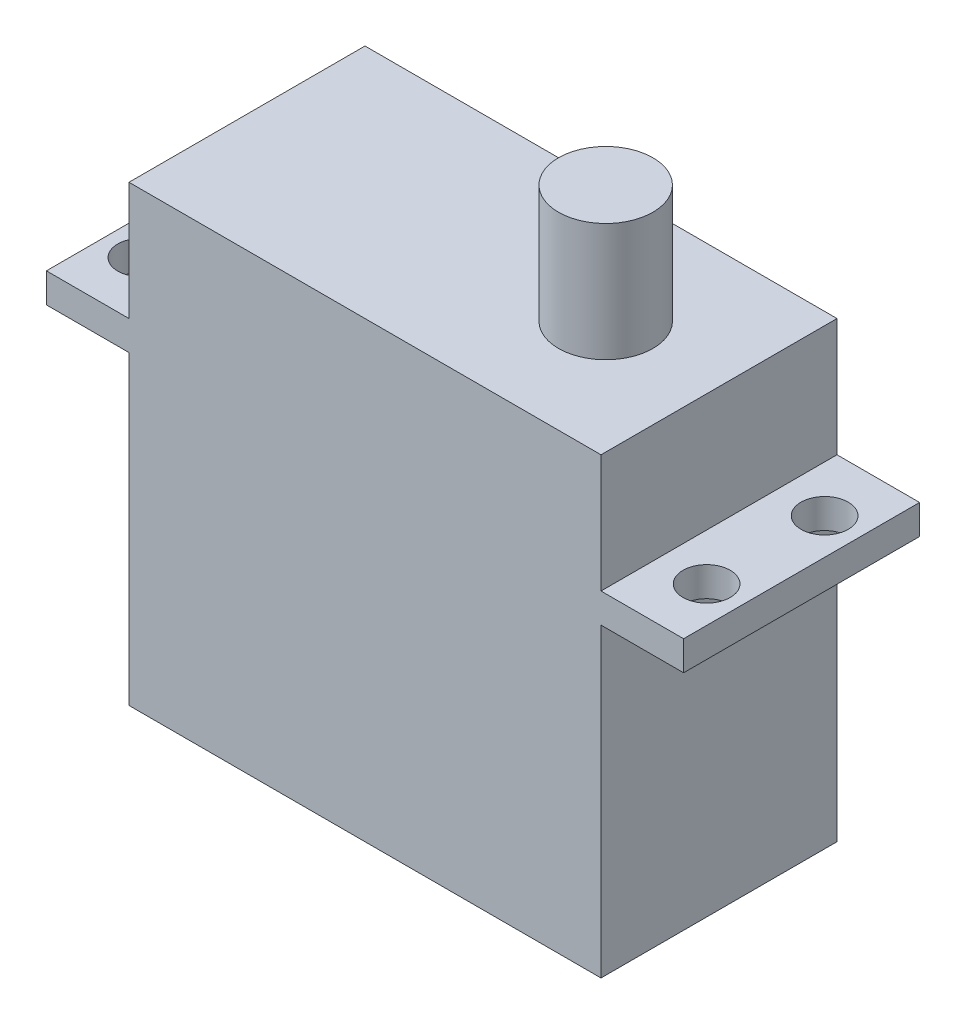
ISO-10303-21;
HEADER;
FILE_DESCRIPTION(('STEP AP214'),'2;1');
FILE_NAME('part.step','',(''),(''),'','','');
FILE_SCHEMA(('AUTOMOTIVE_DESIGN { 1 0 10303 214 1 1 1 1 }'));
ENDSEC;
DATA;
#1=APPLICATION_CONTEXT('core data for automotive mechanical design processes');
#2=APPLICATION_PROTOCOL_DEFINITION('international standard','automotive_design',2000,#1);
#3=PRODUCT_CONTEXT('',#1,'mechanical');
#4=PRODUCT('Part','Part','',(#3));
#5=PRODUCT_RELATED_PRODUCT_CATEGORY('part','',(#4));
#6=PRODUCT_DEFINITION_FORMATION('','',#4);
#7=PRODUCT_DEFINITION_CONTEXT('part definition',#1,'design');
#8=PRODUCT_DEFINITION('design','',#6,#7);
#9=PRODUCT_DEFINITION_SHAPE('','',#8);
#10=(LENGTH_UNIT() NAMED_UNIT(*) SI_UNIT(.MILLI.,.METRE.));
#11=(NAMED_UNIT(*) PLANE_ANGLE_UNIT() SI_UNIT($,.RADIAN.));
#12=(NAMED_UNIT(*) SI_UNIT($,.STERADIAN.) SOLID_ANGLE_UNIT());
#13=UNCERTAINTY_MEASURE_WITH_UNIT(LENGTH_MEASURE(1.E-05),#10,'distance_accuracy_value','');
#14=(GEOMETRIC_REPRESENTATION_CONTEXT(3) GLOBAL_UNCERTAINTY_ASSIGNED_CONTEXT((#13)) GLOBAL_UNIT_ASSIGNED_CONTEXT((#10,
#11,#12)) REPRESENTATION_CONTEXT('',''));
#15=CARTESIAN_POINT('',(0.,0.,0.));
#16=DIRECTION('',(0.,0.,1.));
#17=DIRECTION('',(1.,0.,0.));
#18=AXIS2_PLACEMENT_3D('',#15,#16,#17);
#19=CARTESIAN_POINT('',(0.,28.4,0.));
#20=DIRECTION('',(0.,1.,0.));
#21=DIRECTION('',(0.,0.,1.));
#22=AXIS2_PLACEMENT_3D('',#19,#20,#21);
#23=PLANE('',#22);
#24=DIRECTION('',(0.,0.,-1.));
#25=VECTOR('',#24,1.);
#26=CARTESIAN_POINT('',(20.,28.4,-10.));
#27=LINE('',#26,#25);
#28=CARTESIAN_POINT('',(20.,28.4,10.));
#29=VERTEX_POINT('',#28);
#30=CARTESIAN_POINT('',(20.,28.4,-10.));
#31=VERTEX_POINT('',#30);
#32=EDGE_CURVE('E57',#29,#31,#27,.T.);
#33=ORIENTED_EDGE('',*,*,#32,.F.);
#34=DIRECTION('',(1.,0.,0.));
#35=VECTOR('',#34,1.);
#36=CARTESIAN_POINT('',(0.,28.4,10.));
#37=LINE('',#36,#35);
#38=CARTESIAN_POINT('',(27.,28.4,10.));
#39=VERTEX_POINT('',#38);
#40=EDGE_CURVE('E171',#29,#39,#37,.T.);
#41=ORIENTED_EDGE('',*,*,#40,.T.);
#42=DIRECTION('',(0.,0.,1.));
#43=VECTOR('',#42,1.);
#44=CARTESIAN_POINT('',(27.,28.4,0.));
#45=LINE('',#44,#43);
#46=CARTESIAN_POINT('',(27.,28.4,-10.));
#47=VERTEX_POINT('',#46);
#48=EDGE_CURVE('E175',#47,#39,#45,.T.);
#49=ORIENTED_EDGE('',*,*,#48,.F.);
#50=DIRECTION('',(1.,0.,0.));
#51=VECTOR('',#50,1.);
#52=CARTESIAN_POINT('',(0.,28.4,-10.));
#53=LINE('',#52,#51);
#54=EDGE_CURVE('E62',#31,#47,#53,.T.);
#55=ORIENTED_EDGE('',*,*,#54,.F.);
#56=EDGE_LOOP('',(#33,#41,#49,#55));
#57=FACE_BOUND('',#56,.T.);
#58=CARTESIAN_POINT('',(23.95,28.4,-5.));
#59=DIRECTION('',(0.,1.,0.));
#60=DIRECTION('',(0.,0.,1.));
#61=AXIS2_PLACEMENT_3D('',#58,#59,#60);
#62=CIRCLE('',#61,2.);
#63=CARTESIAN_POINT('',(23.95,28.4,-2.99999999999999));
#64=VERTEX_POINT('',#63);
#65=EDGE_CURVE('E183',#64,#64,#62,.T.);
#66=ORIENTED_EDGE('',*,*,#65,.F.);
#67=EDGE_LOOP('',(#66));
#68=FACE_BOUND('',#67,.T.);
#69=CARTESIAN_POINT('',(23.95,28.4,5.));
#70=DIRECTION('',(0.,1.,0.));
#71=DIRECTION('',(0.,0.,1.));
#72=AXIS2_PLACEMENT_3D('',#69,#70,#71);
#73=CIRCLE('',#72,2.);
#74=CARTESIAN_POINT('',(23.95,28.4,7.));
#75=VERTEX_POINT('',#74);
#76=EDGE_CURVE('E179',#75,#75,#73,.T.);
#77=ORIENTED_EDGE('',*,*,#76,.F.);
#78=EDGE_LOOP('',(#77));
#79=FACE_BOUND('',#78,.T.);
#80=ADVANCED_FACE('F41',(#57,#68,#79),#23,.T.);
#81=CARTESIAN_POINT('',(20.,25.9,-10.));
#82=DIRECTION('',(-1.,0.,0.));
#83=DIRECTION('',(0.,0.,1.));
#84=AXIS2_PLACEMENT_3D('',#81,#82,#83);
#85=PLANE('',#84);
#86=DIRECTION('',(0.,0.,-1.));
#87=VECTOR('',#86,1.);
#88=CARTESIAN_POINT('',(20.,0.,-10.));
#89=LINE('',#88,#87);
#90=CARTESIAN_POINT('',(20.,0.,10.));
#91=VERTEX_POINT('',#90);
#92=CARTESIAN_POINT('',(20.,0.,-10.));
#93=VERTEX_POINT('',#92);
#94=EDGE_CURVE('E240',#91,#93,#89,.T.);
#95=ORIENTED_EDGE('',*,*,#94,.T.);
#96=DIRECTION('',(0.,-1.,0.));
#97=VECTOR('',#96,1.);
#98=CARTESIAN_POINT('',(20.,25.9,-10.));
#99=LINE('',#98,#97);
#100=CARTESIAN_POINT('',(20.,25.9,-10.));
#101=VERTEX_POINT('',#100);
#102=EDGE_CURVE('E11',#101,#93,#99,.T.);
#103=ORIENTED_EDGE('',*,*,#102,.F.);
#104=DIRECTION('',(0.,0.,-1.));
#105=VECTOR('',#104,1.);
#106=CARTESIAN_POINT('',(20.,25.9,-10.));
#107=LINE('',#106,#105);
#108=CARTESIAN_POINT('',(20.,25.9,10.));
#109=VERTEX_POINT('',#108);
#110=EDGE_CURVE('E241',#109,#101,#107,.T.);
#111=ORIENTED_EDGE('',*,*,#110,.F.);
#112=DIRECTION('',(0.,-1.,0.));
#113=VECTOR('',#112,1.);
#114=CARTESIAN_POINT('',(20.,25.9,10.));
#115=LINE('',#114,#113);
#116=EDGE_CURVE('E250',#109,#91,#115,.T.);
#117=ORIENTED_EDGE('',*,*,#116,.T.);
#118=EDGE_LOOP('',(#95,#103,#111,#117));
#119=FACE_BOUND('',#118,.T.);
#120=ADVANCED_FACE('F43',(#119),#85,.F.);
#121=CARTESIAN_POINT('',(-20.,25.9,-10.));
#122=DIRECTION('',(0.,0.,1.));
#123=DIRECTION('',(1.,0.,0.));
#124=AXIS2_PLACEMENT_3D('',#121,#122,#123);
#125=PLANE('',#124);
#126=DIRECTION('',(-1.,0.,0.));
#127=VECTOR('',#126,1.);
#128=CARTESIAN_POINT('',(-20.,0.,-10.));
#129=LINE('',#128,#127);
#130=CARTESIAN_POINT('',(-20.,0.,-10.));
#131=VERTEX_POINT('',#130);
#132=EDGE_CURVE('E254',#93,#131,#129,.T.);
#133=ORIENTED_EDGE('',*,*,#132,.T.);
#134=DIRECTION('',(0.,-1.,0.));
#135=VECTOR('',#134,1.);
#136=CARTESIAN_POINT('',(-20.,25.9,-10.));
#137=LINE('',#136,#135);
#138=CARTESIAN_POINT('',(-20.,25.9,-10.));
#139=VERTEX_POINT('',#138);
#140=EDGE_CURVE('E50',#139,#131,#137,.T.);
#141=ORIENTED_EDGE('',*,*,#140,.F.);
#142=DIRECTION('',(1.,0.,0.));
#143=VECTOR('',#142,1.);
#144=CARTESIAN_POINT('',(0.,25.9,-10.));
#145=LINE('',#144,#143);
#146=CARTESIAN_POINT('',(-27.,25.9,-10.));
#147=VERTEX_POINT('',#146);
#148=EDGE_CURVE('E159',#147,#139,#145,.T.);
#149=ORIENTED_EDGE('',*,*,#148,.F.);
#150=DIRECTION('',(0.,-1.,0.));
#151=VECTOR('',#150,1.);
#152=CARTESIAN_POINT('',(-27.,28.4,-10.));
#153=LINE('',#152,#151);
#154=CARTESIAN_POINT('',(-27.,28.4,-10.));
#155=VERTEX_POINT('',#154);
#156=EDGE_CURVE('E237',#155,#147,#153,.T.);
#157=ORIENTED_EDGE('',*,*,#156,.F.);
#158=CARTESIAN_POINT('',(-20.,28.4,-10.));
#159=VERTEX_POINT('',#158);
#160=EDGE_CURVE('E165',#155,#159,#53,.T.);
#161=ORIENTED_EDGE('',*,*,#160,.T.);
#162=DIRECTION('',(0.,-1.,0.));
#163=VECTOR('',#162,1.);
#164=CARTESIAN_POINT('',(-20.,38.4,-10.));
#165=LINE('',#164,#163);
#166=CARTESIAN_POINT('',(-20.,38.4,-10.));
#167=VERTEX_POINT('',#166);
#168=EDGE_CURVE('E136',#167,#159,#165,.T.);
#169=ORIENTED_EDGE('',*,*,#168,.F.);
#170=DIRECTION('',(-1.,0.,0.));
#171=VECTOR('',#170,1.);
#172=CARTESIAN_POINT('',(-20.,38.4,-10.));
#173=LINE('',#172,#171);
#174=CARTESIAN_POINT('',(20.,38.4,-10.));
#175=VERTEX_POINT('',#174);
#176=EDGE_CURVE('E129',#175,#167,#173,.T.);
#177=ORIENTED_EDGE('',*,*,#176,.F.);
#178=DIRECTION('',(0.,-1.,0.));
#179=VECTOR('',#178,1.);
#180=CARTESIAN_POINT('',(20.,38.4,-10.));
#181=LINE('',#180,#179);
#182=EDGE_CURVE('E133',#175,#31,#181,.T.);
#183=ORIENTED_EDGE('',*,*,#182,.T.);
#184=ORIENTED_EDGE('',*,*,#54,.T.);
#185=DIRECTION('',(0.,-1.,0.));
#186=VECTOR('',#185,1.);
#187=CARTESIAN_POINT('',(27.,28.4,-10.));
#188=LINE('',#187,#186);
#189=CARTESIAN_POINT('',(27.,25.9,-10.));
#190=VERTEX_POINT('',#189);
#191=EDGE_CURVE('E194',#47,#190,#188,.T.);
#192=ORIENTED_EDGE('',*,*,#191,.T.);
#193=EDGE_CURVE('E155',#101,#190,#145,.T.);
#194=ORIENTED_EDGE('',*,*,#193,.F.);
#195=ORIENTED_EDGE('',*,*,#102,.T.);
#196=EDGE_LOOP('',(#133,#141,#149,#157,#161,#169,#177,#183,#184,#192,#194,#195));
#197=FACE_BOUND('',#196,.T.);
#198=ADVANCED_FACE('F131',(#197),#125,.F.);
#199=CARTESIAN_POINT('',(-20.,25.9,-10.));
#200=DIRECTION('',(1.,0.,0.));
#201=DIRECTION('',(0.,0.,-1.));
#202=AXIS2_PLACEMENT_3D('',#199,#200,#201);
#203=PLANE('',#202);
#204=DIRECTION('',(0.,0.,1.));
#205=VECTOR('',#204,1.);
#206=CARTESIAN_POINT('',(-20.,0.,-10.));
#207=LINE('',#206,#205);
#208=CARTESIAN_POINT('',(-20.,0.,10.));
#209=VERTEX_POINT('',#208);
#210=EDGE_CURVE('E257',#131,#209,#207,.T.);
#211=ORIENTED_EDGE('',*,*,#210,.T.);
#212=DIRECTION('',(0.,-1.,0.));
#213=VECTOR('',#212,1.);
#214=CARTESIAN_POINT('',(-20.,25.9,10.));
#215=LINE('',#214,#213);
#216=CARTESIAN_POINT('',(-20.,25.9,10.));
#217=VERTEX_POINT('',#216);
#218=EDGE_CURVE('E265',#217,#209,#215,.T.);
#219=ORIENTED_EDGE('',*,*,#218,.F.);
#220=DIRECTION('',(0.,0.,1.));
#221=VECTOR('',#220,1.);
#222=CARTESIAN_POINT('',(-20.,25.9,-10.));
#223=LINE('',#222,#221);
#224=EDGE_CURVE('E245',#139,#217,#223,.T.);
#225=ORIENTED_EDGE('',*,*,#224,.F.);
#226=ORIENTED_EDGE('',*,*,#140,.T.);
#227=EDGE_LOOP('',(#211,#219,#225,#226));
#228=FACE_BOUND('',#227,.T.);
#229=ADVANCED_FACE('F273',(#228),#203,.F.);
#230=CARTESIAN_POINT('',(-20.,25.9,10.));
#231=DIRECTION('',(0.,0.,-1.));
#232=DIRECTION('',(-1.,0.,0.));
#233=AXIS2_PLACEMENT_3D('',#230,#231,#232);
#234=PLANE('',#233);
#235=DIRECTION('',(1.,0.,0.));
#236=VECTOR('',#235,1.);
#237=CARTESIAN_POINT('',(-20.,0.,10.));
#238=LINE('',#237,#236);
#239=EDGE_CURVE('E246',#209,#91,#238,.T.);
#240=ORIENTED_EDGE('',*,*,#239,.T.);
#241=ORIENTED_EDGE('',*,*,#116,.F.);
#242=DIRECTION('',(1.,0.,0.));
#243=VECTOR('',#242,1.);
#244=CARTESIAN_POINT('',(0.,25.9,10.));
#245=LINE('',#244,#243);
#246=CARTESIAN_POINT('',(27.,25.9,10.));
#247=VERTEX_POINT('',#246);
#248=EDGE_CURVE('E201',#109,#247,#245,.T.);
#249=ORIENTED_EDGE('',*,*,#248,.T.);
#250=DIRECTION('',(0.,-1.,0.));
#251=VECTOR('',#250,1.);
#252=CARTESIAN_POINT('',(27.,28.4,10.));
#253=LINE('',#252,#251);
#254=EDGE_CURVE('E229',#39,#247,#253,.T.);
#255=ORIENTED_EDGE('',*,*,#254,.F.);
#256=ORIENTED_EDGE('',*,*,#40,.F.);
#257=DIRECTION('',(0.,-1.,0.));
#258=VECTOR('',#257,1.);
#259=CARTESIAN_POINT('',(20.,38.4,10.));
#260=LINE('',#259,#258);
#261=CARTESIAN_POINT('',(20.,38.4,10.));
#262=VERTEX_POINT('',#261);
#263=EDGE_CURVE('E351',#262,#29,#260,.T.);
#264=ORIENTED_EDGE('',*,*,#263,.F.);
#265=DIRECTION('',(1.,0.,0.));
#266=VECTOR('',#265,1.);
#267=CARTESIAN_POINT('',(-20.,38.4,10.));
#268=LINE('',#267,#266);
#269=CARTESIAN_POINT('',(-20.,38.4,10.));
#270=VERTEX_POINT('',#269);
#271=EDGE_CURVE('E146',#270,#262,#268,.T.);
#272=ORIENTED_EDGE('',*,*,#271,.F.);
#273=DIRECTION('',(0.,-1.,0.));
#274=VECTOR('',#273,1.);
#275=CARTESIAN_POINT('',(-20.,38.4,10.));
#276=LINE('',#275,#274);
#277=CARTESIAN_POINT('',(-20.,28.4,10.));
#278=VERTEX_POINT('',#277);
#279=EDGE_CURVE('E161',#270,#278,#276,.T.);
#280=ORIENTED_EDGE('',*,*,#279,.T.);
#281=CARTESIAN_POINT('',(-27.,28.4,10.));
#282=VERTEX_POINT('',#281);
#283=EDGE_CURVE('E172',#282,#278,#37,.T.);
#284=ORIENTED_EDGE('',*,*,#283,.F.);
#285=DIRECTION('',(0.,-1.,0.));
#286=VECTOR('',#285,1.);
#287=CARTESIAN_POINT('',(-27.,28.4,10.));
#288=LINE('',#287,#286);
#289=CARTESIAN_POINT('',(-27.,25.9,10.));
#290=VERTEX_POINT('',#289);
#291=EDGE_CURVE('E233',#282,#290,#288,.T.);
#292=ORIENTED_EDGE('',*,*,#291,.T.);
#293=EDGE_CURVE('E202',#290,#217,#245,.T.);
#294=ORIENTED_EDGE('',*,*,#293,.T.);
#295=ORIENTED_EDGE('',*,*,#218,.T.);
#296=EDGE_LOOP('',(#240,#241,#249,#255,#256,#264,#272,#280,#284,#292,#294,#295));
#297=FACE_BOUND('',#296,.T.);
#298=ADVANCED_FACE('F280',(#297),#234,.F.);
#299=CARTESIAN_POINT('',(0.,0.,0.));
#300=DIRECTION('',(0.,1.,0.));
#301=DIRECTION('',(0.,0.,1.));
#302=AXIS2_PLACEMENT_3D('',#299,#300,#301);
#303=PLANE('',#302);
#304=ORIENTED_EDGE('',*,*,#94,.F.);
#305=ORIENTED_EDGE('',*,*,#239,.F.);
#306=ORIENTED_EDGE('',*,*,#210,.F.);
#307=ORIENTED_EDGE('',*,*,#132,.F.);
#308=EDGE_LOOP('',(#304,#305,#306,#307));
#309=FACE_BOUND('',#308,.T.);
#310=ADVANCED_FACE('F278',(#309),#303,.F.);
#311=CARTESIAN_POINT('',(0.,25.9,0.));
#312=DIRECTION('',(0.,1.,0.));
#313=DIRECTION('',(0.,0.,1.));
#314=AXIS2_PLACEMENT_3D('',#311,#312,#313);
#315=PLANE('',#314);
#316=CARTESIAN_POINT('',(23.95,25.9,5.));
#317=DIRECTION('',(0.,1.,0.));
#318=DIRECTION('',(0.,0.,1.));
#319=AXIS2_PLACEMENT_3D('',#316,#317,#318);
#320=CIRCLE('',#319,2.);
#321=CARTESIAN_POINT('',(23.95,25.9,7.));
#322=VERTEX_POINT('',#321);
#323=EDGE_CURVE('E210',#322,#322,#320,.T.);
#324=ORIENTED_EDGE('',*,*,#323,.T.);
#325=EDGE_LOOP('',(#324));
#326=FACE_BOUND('',#325,.T.);
#327=CARTESIAN_POINT('',(23.95,25.9,-5.));
#328=DIRECTION('',(0.,1.,0.));
#329=DIRECTION('',(0.,0.,1.));
#330=AXIS2_PLACEMENT_3D('',#327,#328,#329);
#331=CIRCLE('',#330,2.);
#332=CARTESIAN_POINT('',(23.95,25.9,-2.99999999999999));
#333=VERTEX_POINT('',#332);
#334=EDGE_CURVE('E214',#333,#333,#331,.T.);
#335=ORIENTED_EDGE('',*,*,#334,.T.);
#336=EDGE_LOOP('',(#335));
#337=FACE_BOUND('',#336,.T.);
#338=ORIENTED_EDGE('',*,*,#248,.F.);
#339=ORIENTED_EDGE('',*,*,#110,.T.);
#340=ORIENTED_EDGE('',*,*,#193,.T.);
#341=DIRECTION('',(0.,0.,1.));
#342=VECTOR('',#341,1.);
#343=CARTESIAN_POINT('',(27.,25.9,0.));
#344=LINE('',#343,#342);
#345=EDGE_CURVE('E206',#190,#247,#344,.T.);
#346=ORIENTED_EDGE('',*,*,#345,.T.);
#347=EDGE_LOOP('',(#338,#339,#340,#346));
#348=FACE_BOUND('',#347,.T.);
#349=ADVANCED_FACE('F286',(#326,#337,#348),#315,.F.);
#350=CARTESIAN_POINT('',(-23.95,25.9,-5.));
#351=DIRECTION('',(0.,1.,0.));
#352=DIRECTION('',(0.,0.,1.));
#353=AXIS2_PLACEMENT_3D('',#350,#351,#352);
#354=CIRCLE('',#353,2.);
#355=CARTESIAN_POINT('',(-23.95,25.9,-2.99999999999999));
#356=VERTEX_POINT('',#355);
#357=EDGE_CURVE('E222',#356,#356,#354,.T.);
#358=ORIENTED_EDGE('',*,*,#357,.T.);
#359=EDGE_LOOP('',(#358));
#360=FACE_BOUND('',#359,.T.);
#361=CARTESIAN_POINT('',(-23.95,25.9,5.));
#362=DIRECTION('',(0.,1.,0.));
#363=DIRECTION('',(0.,0.,1.));
#364=AXIS2_PLACEMENT_3D('',#361,#362,#363);
#365=CIRCLE('',#364,2.);
#366=CARTESIAN_POINT('',(-23.95,25.9,7.00000000000001));
#367=VERTEX_POINT('',#366);
#368=EDGE_CURVE('E218',#367,#367,#365,.T.);
#369=ORIENTED_EDGE('',*,*,#368,.T.);
#370=EDGE_LOOP('',(#369));
#371=FACE_BOUND('',#370,.T.);
#372=ORIENTED_EDGE('',*,*,#148,.T.);
#373=ORIENTED_EDGE('',*,*,#224,.T.);
#374=ORIENTED_EDGE('',*,*,#293,.F.);
#375=DIRECTION('',(0.,0.,1.));
#376=VECTOR('',#375,1.);
#377=CARTESIAN_POINT('',(-27.,25.9,0.));
#378=LINE('',#377,#376);
#379=EDGE_CURVE('E198',#147,#290,#378,.T.);
#380=ORIENTED_EDGE('',*,*,#379,.F.);
#381=EDGE_LOOP('',(#372,#373,#374,#380));
#382=FACE_BOUND('',#381,.T.);
#383=ADVANCED_FACE('F333',(#360,#371,#382),#315,.F.);
#384=CARTESIAN_POINT('',(-27.,28.4,0.));
#385=DIRECTION('',(1.,0.,0.));
#386=DIRECTION('',(0.,0.,-1.));
#387=AXIS2_PLACEMENT_3D('',#384,#385,#386);
#388=PLANE('',#387);
#389=ORIENTED_EDGE('',*,*,#379,.T.);
#390=ORIENTED_EDGE('',*,*,#291,.F.);
#391=DIRECTION('',(0.,0.,1.));
#392=VECTOR('',#391,1.);
#393=CARTESIAN_POINT('',(-27.,28.4,0.));
#394=LINE('',#393,#392);
#395=EDGE_CURVE('E168',#155,#282,#394,.T.);
#396=ORIENTED_EDGE('',*,*,#395,.F.);
#397=ORIENTED_EDGE('',*,*,#156,.T.);
#398=EDGE_LOOP('',(#389,#390,#396,#397));
#399=FACE_BOUND('',#398,.T.);
#400=ADVANCED_FACE('F336',(#399),#388,.F.);
#401=CARTESIAN_POINT('',(-23.95,28.4,5.));
#402=DIRECTION('',(0.,-1.,0.));
#403=DIRECTION('',(0.,0.,-1.));
#404=AXIS2_PLACEMENT_3D('',#401,#402,#403);
#405=CYLINDRICAL_SURFACE('',#404,2.);
#406=CARTESIAN_POINT('',(-23.95,28.4,5.));
#407=DIRECTION('',(0.,1.,0.));
#408=DIRECTION('',(0.,0.,1.));
#409=AXIS2_PLACEMENT_3D('',#406,#407,#408);
#410=CIRCLE('',#409,2.);
#411=CARTESIAN_POINT('',(-23.95,28.4,7.00000000000001));
#412=VERTEX_POINT('',#411);
#413=EDGE_CURVE('E187',#412,#412,#410,.T.);
#414=ORIENTED_EDGE('',*,*,#413,.T.);
#415=EDGE_LOOP('',(#414));
#416=FACE_BOUND('',#415,.T.);
#417=ORIENTED_EDGE('',*,*,#368,.F.);
#418=EDGE_LOOP('',(#417));
#419=FACE_BOUND('',#418,.T.);
#420=ADVANCED_FACE('F464',(#416,#419),#405,.F.);
#421=CARTESIAN_POINT('',(23.95,28.4,-5.));
#422=DIRECTION('',(0.,-1.,0.));
#423=DIRECTION('',(0.,0.,-1.));
#424=AXIS2_PLACEMENT_3D('',#421,#422,#423);
#425=CYLINDRICAL_SURFACE('',#424,2.);
#426=ORIENTED_EDGE('',*,*,#65,.T.);
#427=EDGE_LOOP('',(#426));
#428=FACE_BOUND('',#427,.T.);
#429=ORIENTED_EDGE('',*,*,#334,.F.);
#430=EDGE_LOOP('',(#429));
#431=FACE_BOUND('',#430,.T.);
#432=ADVANCED_FACE('F307',(#428,#431),#425,.F.);
#433=CARTESIAN_POINT('',(23.95,28.4,5.));
#434=DIRECTION('',(0.,-1.,0.));
#435=DIRECTION('',(0.,0.,-1.));
#436=AXIS2_PLACEMENT_3D('',#433,#434,#435);
#437=CYLINDRICAL_SURFACE('',#436,2.);
#438=ORIENTED_EDGE('',*,*,#76,.T.);
#439=EDGE_LOOP('',(#438));
#440=FACE_BOUND('',#439,.T.);
#441=ORIENTED_EDGE('',*,*,#323,.F.);
#442=EDGE_LOOP('',(#441));
#443=FACE_BOUND('',#442,.T.);
#444=ADVANCED_FACE('F298',(#440,#443),#437,.F.);
#445=CARTESIAN_POINT('',(27.,28.4,0.));
#446=DIRECTION('',(1.,0.,0.));
#447=DIRECTION('',(0.,0.,-1.));
#448=AXIS2_PLACEMENT_3D('',#445,#446,#447);
#449=PLANE('',#448);
#450=ORIENTED_EDGE('',*,*,#345,.F.);
#451=ORIENTED_EDGE('',*,*,#191,.F.);
#452=ORIENTED_EDGE('',*,*,#48,.T.);
#453=ORIENTED_EDGE('',*,*,#254,.T.);
#454=EDGE_LOOP('',(#450,#451,#452,#453));
#455=FACE_BOUND('',#454,.T.);
#456=ADVANCED_FACE('F295',(#455),#449,.T.);
#457=CARTESIAN_POINT('',(-23.95,28.4,-5.));
#458=DIRECTION('',(0.,-1.,0.));
#459=DIRECTION('',(0.,0.,-1.));
#460=AXIS2_PLACEMENT_3D('',#457,#458,#459);
#461=CYLINDRICAL_SURFACE('',#460,2.);
#462=CARTESIAN_POINT('',(-23.95,28.4,-5.));
#463=DIRECTION('',(0.,1.,0.));
#464=DIRECTION('',(0.,0.,1.));
#465=AXIS2_PLACEMENT_3D('',#462,#463,#464);
#466=CIRCLE('',#465,2.);
#467=CARTESIAN_POINT('',(-23.95,28.4,-2.99999999999999));
#468=VERTEX_POINT('',#467);
#469=EDGE_CURVE('E191',#468,#468,#466,.T.);
#470=ORIENTED_EDGE('',*,*,#469,.T.);
#471=EDGE_LOOP('',(#470));
#472=FACE_BOUND('',#471,.T.);
#473=ORIENTED_EDGE('',*,*,#357,.F.);
#474=EDGE_LOOP('',(#473));
#475=FACE_BOUND('',#474,.T.);
#476=ADVANCED_FACE('F297',(#472,#475),#461,.F.);
#477=DIRECTION('',(0.,0.,1.));
#478=VECTOR('',#477,1.);
#479=CARTESIAN_POINT('',(-20.,28.4,-10.));
#480=LINE('',#479,#478);
#481=EDGE_CURVE('E151',#159,#278,#480,.T.);
#482=ORIENTED_EDGE('',*,*,#481,.F.);
#483=ORIENTED_EDGE('',*,*,#160,.F.);
#484=ORIENTED_EDGE('',*,*,#395,.T.);
#485=ORIENTED_EDGE('',*,*,#283,.T.);
#486=EDGE_LOOP('',(#482,#483,#484,#485));
#487=FACE_BOUND('',#486,.T.);
#488=ORIENTED_EDGE('',*,*,#413,.F.);
#489=EDGE_LOOP('',(#488));
#490=FACE_BOUND('',#489,.T.);
#491=ORIENTED_EDGE('',*,*,#469,.F.);
#492=EDGE_LOOP('',(#491));
#493=FACE_BOUND('',#492,.T.);
#494=ADVANCED_FACE('F304',(#487,#490,#493),#23,.T.);
#495=CARTESIAN_POINT('',(20.,38.4,-10.));
#496=DIRECTION('',(-1.,0.,0.));
#497=DIRECTION('',(0.,0.,1.));
#498=AXIS2_PLACEMENT_3D('',#495,#496,#497);
#499=PLANE('',#498);
#500=ORIENTED_EDGE('',*,*,#32,.T.);
#501=ORIENTED_EDGE('',*,*,#182,.F.);
#502=DIRECTION('',(0.,0.,-1.));
#503=VECTOR('',#502,1.);
#504=CARTESIAN_POINT('',(20.,38.4,-10.));
#505=LINE('',#504,#503);
#506=EDGE_CURVE('E141',#262,#175,#505,.T.);
#507=ORIENTED_EDGE('',*,*,#506,.F.);
#508=ORIENTED_EDGE('',*,*,#263,.T.);
#509=EDGE_LOOP('',(#500,#501,#507,#508));
#510=FACE_BOUND('',#509,.T.);
#511=ADVANCED_FACE('F153',(#510),#499,.F.);
#512=CARTESIAN_POINT('',(-20.,38.4,-10.));
#513=DIRECTION('',(1.,0.,0.));
#514=DIRECTION('',(0.,0.,-1.));
#515=AXIS2_PLACEMENT_3D('',#512,#513,#514);
#516=PLANE('',#515);
#517=ORIENTED_EDGE('',*,*,#481,.T.);
#518=ORIENTED_EDGE('',*,*,#279,.F.);
#519=DIRECTION('',(0.,0.,1.));
#520=VECTOR('',#519,1.);
#521=CARTESIAN_POINT('',(-20.,38.4,-10.));
#522=LINE('',#521,#520);
#523=EDGE_CURVE('E140',#167,#270,#522,.T.);
#524=ORIENTED_EDGE('',*,*,#523,.F.);
#525=ORIENTED_EDGE('',*,*,#168,.T.);
#526=EDGE_LOOP('',(#517,#518,#524,#525));
#527=FACE_BOUND('',#526,.T.);
#528=ADVANCED_FACE('F323',(#527),#516,.F.);
#529=CARTESIAN_POINT('',(0.,38.4,0.));
#530=DIRECTION('',(0.,1.,0.));
#531=DIRECTION('',(0.,0.,1.));
#532=AXIS2_PLACEMENT_3D('',#529,#530,#531);
#533=PLANE('',#532);
#534=CARTESIAN_POINT('',(10.4,38.4,0.));
#535=DIRECTION('',(0.,1.,0.));
#536=DIRECTION('',(0.,0.,1.));
#537=AXIS2_PLACEMENT_3D('',#534,#535,#536);
#538=CIRCLE('',#537,4.);
#539=CARTESIAN_POINT('',(10.4,38.4,4.));
#540=VERTEX_POINT('',#539);
#541=EDGE_CURVE('E362',#540,#540,#538,.T.);
#542=ORIENTED_EDGE('',*,*,#541,.F.);
#543=EDGE_LOOP('',(#542));
#544=FACE_BOUND('',#543,.T.);
#545=ORIENTED_EDGE('',*,*,#506,.T.);
#546=ORIENTED_EDGE('',*,*,#176,.T.);
#547=ORIENTED_EDGE('',*,*,#523,.T.);
#548=ORIENTED_EDGE('',*,*,#271,.T.);
#549=EDGE_LOOP('',(#545,#546,#547,#548));
#550=FACE_BOUND('',#549,.T.);
#551=ADVANCED_FACE('F144',(#544,#550),#533,.T.);
#552=CARTESIAN_POINT('',(10.4,48.4,0.));
#553=DIRECTION('',(0.,-1.,0.));
#554=DIRECTION('',(0.,0.,-1.));
#555=AXIS2_PLACEMENT_3D('',#552,#553,#554);
#556=CYLINDRICAL_SURFACE('',#555,4.);
#557=CARTESIAN_POINT('',(10.4,48.4,0.));
#558=DIRECTION('',(0.,1.,0.));
#559=DIRECTION('',(0.,0.,1.));
#560=AXIS2_PLACEMENT_3D('',#557,#558,#559);
#561=CIRCLE('',#560,4.);
#562=CARTESIAN_POINT('',(10.4,48.4,4.));
#563=VERTEX_POINT('',#562);
#564=EDGE_CURVE('E357',#563,#563,#561,.T.);
#565=ORIENTED_EDGE('',*,*,#564,.F.);
#566=EDGE_LOOP('',(#565));
#567=FACE_BOUND('',#566,.T.);
#568=ORIENTED_EDGE('',*,*,#541,.T.);
#569=EDGE_LOOP('',(#568));
#570=FACE_BOUND('',#569,.T.);
#571=ADVANCED_FACE('F372',(#567,#570),#556,.T.);
#572=CARTESIAN_POINT('',(0.,48.4,0.));
#573=DIRECTION('',(0.,1.,0.));
#574=DIRECTION('',(0.,0.,1.));
#575=AXIS2_PLACEMENT_3D('',#572,#573,#574);
#576=PLANE('',#575);
#577=ORIENTED_EDGE('',*,*,#564,.T.);
#578=EDGE_LOOP('',(#577));
#579=FACE_BOUND('',#578,.T.);
#580=ADVANCED_FACE('F370',(#579),#576,.T.);
#581=CLOSED_SHELL('',(#80,#120,#198,#229,#298,#310,#349,#383,#400,#420,#432,#444,#456,#476,#494,
#511,#528,#551,#571,#580));
#582=MANIFOLD_SOLID_BREP('B2',#581);
#583=ADVANCED_BREP_SHAPE_REPRESENTATION('',(#18,#582),#14);
#584=SHAPE_DEFINITION_REPRESENTATION(#9,#583);
ENDSEC;
END-ISO-10303-21;
